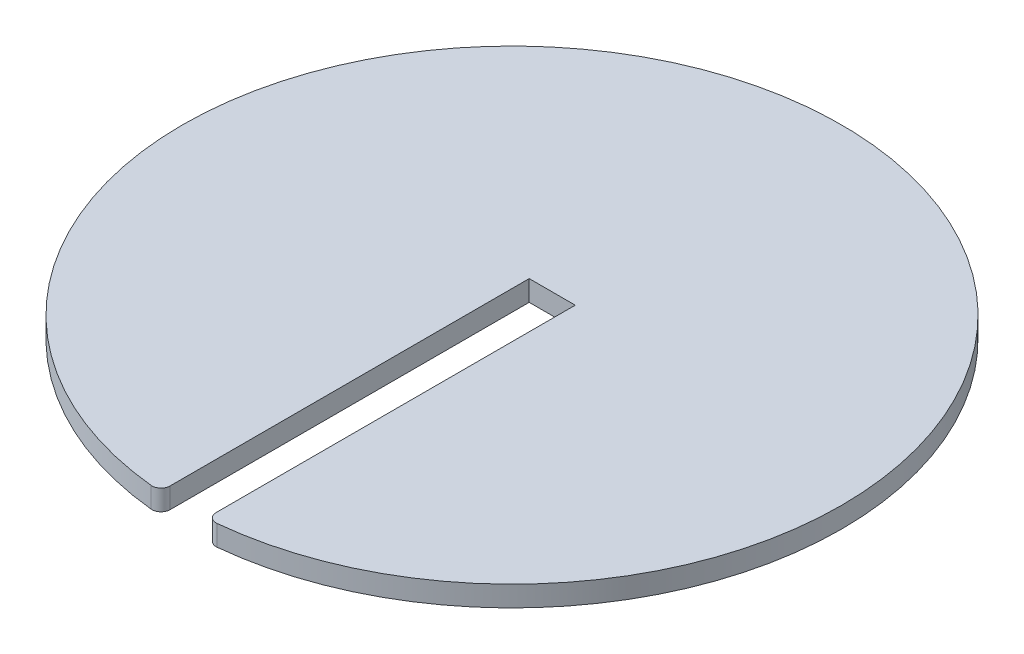
ISO-10303-21;
HEADER;
FILE_DESCRIPTION(('STEP AP214'),'2;1');
FILE_NAME('part.step','',(''),(''),'','','');
FILE_SCHEMA(('AUTOMOTIVE_DESIGN { 1 0 10303 214 1 1 1 1 }'));
ENDSEC;
DATA;
#1=APPLICATION_CONTEXT('core data for automotive mechanical design processes');
#2=APPLICATION_PROTOCOL_DEFINITION('international standard','automotive_design',2000,#1);
#3=PRODUCT_CONTEXT('',#1,'mechanical');
#4=PRODUCT('Part','Part','',(#3));
#5=PRODUCT_RELATED_PRODUCT_CATEGORY('part','',(#4));
#6=PRODUCT_DEFINITION_FORMATION('','',#4);
#7=PRODUCT_DEFINITION_CONTEXT('part definition',#1,'design');
#8=PRODUCT_DEFINITION('design','',#6,#7);
#9=PRODUCT_DEFINITION_SHAPE('','',#8);
#10=(LENGTH_UNIT() NAMED_UNIT(*) SI_UNIT(.MILLI.,.METRE.));
#11=(NAMED_UNIT(*) PLANE_ANGLE_UNIT() SI_UNIT($,.RADIAN.));
#12=(NAMED_UNIT(*) SI_UNIT($,.STERADIAN.) SOLID_ANGLE_UNIT());
#13=UNCERTAINTY_MEASURE_WITH_UNIT(LENGTH_MEASURE(1.E-05),#10,'distance_accuracy_value','');
#14=(GEOMETRIC_REPRESENTATION_CONTEXT(3) GLOBAL_UNCERTAINTY_ASSIGNED_CONTEXT((#13)) GLOBAL_UNIT_ASSIGNED_CONTEXT((#10,
#11,#12)) REPRESENTATION_CONTEXT('',''));
#15=CARTESIAN_POINT('',(0.,0.,0.));
#16=DIRECTION('',(0.,0.,1.));
#17=DIRECTION('',(1.,0.,0.));
#18=AXIS2_PLACEMENT_3D('',#15,#16,#17);
#19=CARTESIAN_POINT('',(5.95849517111807,1.5875,-8.14858922292322));
#20=DIRECTION('',(0.,0.,-1.));
#21=DIRECTION('',(-1.,0.,0.));
#22=AXIS2_PLACEMENT_3D('',#19,#20,#21);
#23=PLANE('',#22);
#24=DIRECTION('',(1.,0.,0.));
#25=VECTOR('',#24,1.);
#26=CARTESIAN_POINT('',(5.95849517111807,0.,-8.14858922292322));
#27=LINE('',#26,#25);
#28=CARTESIAN_POINT('',(2.40849517111807,0.,-8.14858922292322));
#29=VERTEX_POINT('',#28);
#30=CARTESIAN_POINT('',(5.95849517111807,0.,-8.14858922292322));
#31=VERTEX_POINT('',#30);
#32=EDGE_CURVE('E137',#29,#31,#27,.T.);
#33=ORIENTED_EDGE('',*,*,#32,.T.);
#34=DIRECTION('',(0.,-1.,0.));
#35=VECTOR('',#34,1.);
#36=CARTESIAN_POINT('',(5.95849517111807,1.5875,-8.14858922292322));
#37=LINE('',#36,#35);
#38=CARTESIAN_POINT('',(5.95849517111807,1.5875,-8.14858922292322));
#39=VERTEX_POINT('',#38);
#40=EDGE_CURVE('E104',#39,#31,#37,.T.);
#41=ORIENTED_EDGE('',*,*,#40,.F.);
#42=DIRECTION('',(1.,0.,0.));
#43=VECTOR('',#42,1.);
#44=CARTESIAN_POINT('',(5.95849517111807,1.5875,-8.14858922292322));
#45=LINE('',#44,#43);
#46=CARTESIAN_POINT('',(2.40849517111807,1.5875,-8.14858922292322));
#47=VERTEX_POINT('',#46);
#48=EDGE_CURVE('E90',#47,#39,#45,.T.);
#49=ORIENTED_EDGE('',*,*,#48,.F.);
#50=DIRECTION('',(0.,-1.,0.));
#51=VECTOR('',#50,1.);
#52=CARTESIAN_POINT('',(2.40849517111807,1.5875,-8.14858922292322));
#53=LINE('',#52,#51);
#54=EDGE_CURVE('E102',#47,#29,#53,.T.);
#55=ORIENTED_EDGE('',*,*,#54,.T.);
#56=EDGE_LOOP('',(#33,#41,#49,#55));
#57=FACE_BOUND('',#56,.T.);
#58=ADVANCED_FACE('F33',(#57),#23,.F.);
#59=CARTESIAN_POINT('',(5.95849517111807,1.5875,-1.94858922292322));
#60=DIRECTION('',(1.,0.,0.));
#61=DIRECTION('',(0.,0.,-1.));
#62=AXIS2_PLACEMENT_3D('',#59,#60,#61);
#63=PLANE('',#62);
#64=DIRECTION('',(0.,0.,1.));
#65=VECTOR('',#64,1.);
#66=CARTESIAN_POINT('',(5.95849517111807,0.,-1.94858922292322));
#67=LINE('',#66,#65);
#68=CARTESIAN_POINT('',(5.95849517111807,0.,19.5270974409322));
#69=VERTEX_POINT('',#68);
#70=EDGE_CURVE('E134',#31,#69,#67,.T.);
#71=ORIENTED_EDGE('',*,*,#70,.T.);
#72=DIRECTION('',(0.,-1.,0.));
#73=VECTOR('',#72,1.);
#74=CARTESIAN_POINT('',(5.95849517111807,1.5875,19.5270974409322));
#75=LINE('',#74,#73);
#76=CARTESIAN_POINT('',(5.95849517111807,1.5875,19.5270974409322));
#77=VERTEX_POINT('',#76);
#78=EDGE_CURVE('E11',#69,#77,#75,.F.);
#79=ORIENTED_EDGE('',*,*,#78,.T.);
#80=DIRECTION('',(0.,0.,1.));
#81=VECTOR('',#80,1.);
#82=CARTESIAN_POINT('',(5.95849517111807,1.5875,-8.14858922292322));
#83=LINE('',#82,#81);
#84=EDGE_CURVE('E105',#39,#77,#83,.T.);
#85=ORIENTED_EDGE('',*,*,#84,.F.);
#86=ORIENTED_EDGE('',*,*,#40,.T.);
#87=EDGE_LOOP('',(#71,#79,#85,#86));
#88=FACE_BOUND('',#87,.T.);
#89=ADVANCED_FACE('F136',(#88),#63,.F.);
#90=CARTESIAN_POINT('',(4.18349517111807,1.5875,-5.04858922292322));
#91=DIRECTION('',(0.,-1.,0.));
#92=DIRECTION('',(0.,0.,-1.));
#93=AXIS2_PLACEMENT_3D('',#90,#91,#92);
#94=CYLINDRICAL_SURFACE('',#93,25.4);
#95=CARTESIAN_POINT('',(4.18349517111807,0.,-5.04858922292322));
#96=DIRECTION('',(0.,1.,0.));
#97=DIRECTION('',(0.,0.,1.));
#98=AXIS2_PLACEMENT_3D('',#95,#96,#97);
#99=CIRCLE('',#98,25.4);
#100=CARTESIAN_POINT('',(6.72863687152293,0.,20.22357439092));
#101=VERTEX_POINT('',#100);
#102=CARTESIAN_POINT('',(1.63835347071322,0.,20.22357439092));
#103=VERTEX_POINT('',#102);
#104=EDGE_CURVE('E135',#101,#103,#99,.T.);
#105=ORIENTED_EDGE('',*,*,#104,.T.);
#106=DIRECTION('',(0.,-1.,0.));
#107=VECTOR('',#106,1.);
#108=CARTESIAN_POINT('',(1.63835347071322,1.5875,20.22357439092));
#109=LINE('',#108,#107);
#110=CARTESIAN_POINT('',(1.63835347071322,1.5875,20.22357439092));
#111=VERTEX_POINT('',#110);
#112=EDGE_CURVE('E54',#103,#111,#109,.F.);
#113=ORIENTED_EDGE('',*,*,#112,.T.);
#114=CARTESIAN_POINT('',(4.18349517111807,1.5875,-5.04858922292322));
#115=DIRECTION('',(0.,1.,0.));
#116=DIRECTION('',(0.,0.,1.));
#117=AXIS2_PLACEMENT_3D('',#114,#115,#116);
#118=CIRCLE('',#117,25.4);
#119=CARTESIAN_POINT('',(6.72863687152293,1.5875,20.22357439092));
#120=VERTEX_POINT('',#119);
#121=EDGE_CURVE('E114',#120,#111,#118,.T.);
#122=ORIENTED_EDGE('',*,*,#121,.F.);
#123=DIRECTION('',(0.,-1.,0.));
#124=VECTOR('',#123,1.);
#125=CARTESIAN_POINT('',(6.72863687152293,1.5875,20.22357439092));
#126=LINE('',#125,#124);
#127=EDGE_CURVE('E121',#120,#101,#126,.T.);
#128=ORIENTED_EDGE('',*,*,#127,.T.);
#129=EDGE_LOOP('',(#105,#113,#122,#128));
#130=FACE_BOUND('',#129,.T.);
#131=ADVANCED_FACE('F129',(#130),#94,.T.);
#132=CARTESIAN_POINT('',(2.40849517111807,1.5875,-1.94858922292322));
#133=DIRECTION('',(-1.,0.,0.));
#134=DIRECTION('',(0.,0.,1.));
#135=AXIS2_PLACEMENT_3D('',#132,#133,#134);
#136=PLANE('',#135);
#137=DIRECTION('',(0.,0.,-1.));
#138=VECTOR('',#137,1.);
#139=CARTESIAN_POINT('',(2.40849517111807,1.5875,-8.14858922292322));
#140=LINE('',#139,#138);
#141=CARTESIAN_POINT('',(2.40849517111808,1.5875,19.5270974409322));
#142=VERTEX_POINT('',#141);
#143=EDGE_CURVE('E87',#142,#47,#140,.T.);
#144=ORIENTED_EDGE('',*,*,#143,.F.);
#145=DIRECTION('',(0.,-1.,0.));
#146=VECTOR('',#145,1.);
#147=CARTESIAN_POINT('',(2.40849517111807,1.5875,19.5270974409322));
#148=LINE('',#147,#146);
#149=CARTESIAN_POINT('',(2.40849517111807,0.,19.5270974409322));
#150=VERTEX_POINT('',#149);
#151=EDGE_CURVE('E110',#142,#150,#148,.T.);
#152=ORIENTED_EDGE('',*,*,#151,.T.);
#153=DIRECTION('',(0.,0.,-1.));
#154=VECTOR('',#153,1.);
#155=CARTESIAN_POINT('',(2.40849517111807,0.,-1.94858922292322));
#156=LINE('',#155,#154);
#157=EDGE_CURVE('E97',#150,#29,#156,.T.);
#158=ORIENTED_EDGE('',*,*,#157,.T.);
#159=ORIENTED_EDGE('',*,*,#54,.F.);
#160=EDGE_LOOP('',(#144,#152,#158,#159));
#161=FACE_BOUND('',#160,.T.);
#162=ADVANCED_FACE('F107',(#161),#136,.F.);
#163=CARTESIAN_POINT('',(4.18349517111807,1.5875,-5.04858922292322));
#164=DIRECTION('',(0.,1.,0.));
#165=DIRECTION('',(0.,0.,1.));
#166=AXIS2_PLACEMENT_3D('',#163,#164,#165);
#167=PLANE('',#166);
#168=ORIENTED_EDGE('',*,*,#121,.T.);
#169=CARTESIAN_POINT('',(1.70849517111807,1.5875,19.5270974409322));
#170=DIRECTION('',(0.,1.,0.));
#171=DIRECTION('',(0.,0.,1.));
#172=AXIS2_PLACEMENT_3D('',#169,#170,#171);
#173=CIRCLE('',#172,0.7);
#174=EDGE_CURVE('E41',#111,#142,#173,.T.);
#175=ORIENTED_EDGE('',*,*,#174,.T.);
#176=ORIENTED_EDGE('',*,*,#143,.T.);
#177=ORIENTED_EDGE('',*,*,#48,.T.);
#178=ORIENTED_EDGE('',*,*,#84,.T.);
#179=CARTESIAN_POINT('',(6.65849517111807,1.5875,19.5270974409322));
#180=DIRECTION('',(0.,1.,0.));
#181=DIRECTION('',(0.,0.,1.));
#182=AXIS2_PLACEMENT_3D('',#179,#180,#181);
#183=CIRCLE('',#182,0.7);
#184=EDGE_CURVE('E125',#77,#120,#183,.T.);
#185=ORIENTED_EDGE('',*,*,#184,.T.);
#186=EDGE_LOOP('',(#168,#175,#176,#177,#178,#185));
#187=FACE_BOUND('',#186,.T.);
#188=ADVANCED_FACE('F89',(#187),#167,.T.);
#189=CARTESIAN_POINT('',(4.18349517111807,0.,-5.04858922292322));
#190=DIRECTION('',(0.,1.,0.));
#191=DIRECTION('',(0.,0.,1.));
#192=AXIS2_PLACEMENT_3D('',#189,#190,#191);
#193=PLANE('',#192);
#194=ORIENTED_EDGE('',*,*,#157,.F.);
#195=CARTESIAN_POINT('',(1.70849517111807,0.,19.5270974409322));
#196=DIRECTION('',(0.,1.,0.));
#197=DIRECTION('',(0.,0.,1.));
#198=AXIS2_PLACEMENT_3D('',#195,#196,#197);
#199=CIRCLE('',#198,0.7);
#200=EDGE_CURVE('E119',#150,#103,#199,.F.);
#201=ORIENTED_EDGE('',*,*,#200,.T.);
#202=ORIENTED_EDGE('',*,*,#104,.F.);
#203=CARTESIAN_POINT('',(6.65849517111807,0.,19.5270974409322));
#204=DIRECTION('',(0.,1.,0.));
#205=DIRECTION('',(0.,0.,1.));
#206=AXIS2_PLACEMENT_3D('',#203,#204,#205);
#207=CIRCLE('',#206,0.7);
#208=EDGE_CURVE('E112',#101,#69,#207,.F.);
#209=ORIENTED_EDGE('',*,*,#208,.T.);
#210=ORIENTED_EDGE('',*,*,#70,.F.);
#211=ORIENTED_EDGE('',*,*,#32,.F.);
#212=EDGE_LOOP('',(#194,#201,#202,#209,#210,#211));
#213=FACE_BOUND('',#212,.T.);
#214=ADVANCED_FACE('F133',(#213),#193,.F.);
#215=CARTESIAN_POINT('',(1.70849517111807,1.5875,19.5270974409322));
#216=DIRECTION('',(0.,-1.,0.));
#217=DIRECTION('',(0.,0.,-1.));
#218=AXIS2_PLACEMENT_3D('',#215,#216,#217);
#219=CYLINDRICAL_SURFACE('',#218,0.7);
#220=ORIENTED_EDGE('',*,*,#174,.F.);
#221=ORIENTED_EDGE('',*,*,#112,.F.);
#222=ORIENTED_EDGE('',*,*,#200,.F.);
#223=ORIENTED_EDGE('',*,*,#151,.F.);
#224=EDGE_LOOP('',(#220,#221,#222,#223));
#225=FACE_BOUND('',#224,.T.);
#226=ADVANCED_FACE('F143',(#225),#219,.T.);
#227=CARTESIAN_POINT('',(6.65849517111807,1.5875,19.5270974409322));
#228=DIRECTION('',(0.,-1.,0.));
#229=DIRECTION('',(0.,0.,-1.));
#230=AXIS2_PLACEMENT_3D('',#227,#228,#229);
#231=CYLINDRICAL_SURFACE('',#230,0.7);
#232=ORIENTED_EDGE('',*,*,#184,.F.);
#233=ORIENTED_EDGE('',*,*,#78,.F.);
#234=ORIENTED_EDGE('',*,*,#208,.F.);
#235=ORIENTED_EDGE('',*,*,#127,.F.);
#236=EDGE_LOOP('',(#232,#233,#234,#235));
#237=FACE_BOUND('',#236,.T.);
#238=ADVANCED_FACE('F35',(#237),#231,.T.);
#239=CLOSED_SHELL('',(#58,#89,#131,#162,#188,#214,#226,#238));
#240=MANIFOLD_SOLID_BREP('B2',#239);
#241=ADVANCED_BREP_SHAPE_REPRESENTATION('',(#18,#240),#14);
#242=SHAPE_DEFINITION_REPRESENTATION(#9,#241);
ENDSEC;
END-ISO-10303-21;
